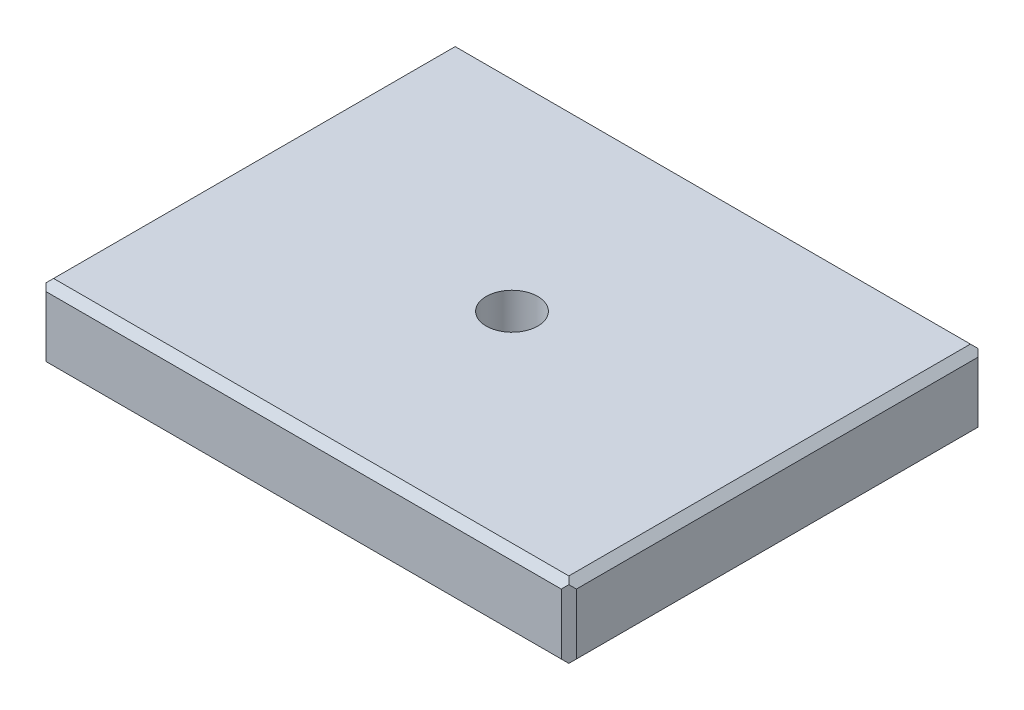
ISO-10303-21;
HEADER;
FILE_DESCRIPTION(('STEP AP214'),'2;1');
FILE_NAME('part.step','',(''),(''),'','','');
FILE_SCHEMA(('AUTOMOTIVE_DESIGN { 1 0 10303 214 1 1 1 1 }'));
ENDSEC;
DATA;
#1=APPLICATION_CONTEXT('core data for automotive mechanical design processes');
#2=APPLICATION_PROTOCOL_DEFINITION('international standard','automotive_design',2000,#1);
#3=PRODUCT_CONTEXT('',#1,'mechanical');
#4=PRODUCT('Part','Part','',(#3));
#5=PRODUCT_RELATED_PRODUCT_CATEGORY('part','',(#4));
#6=PRODUCT_DEFINITION_FORMATION('','',#4);
#7=PRODUCT_DEFINITION_CONTEXT('part definition',#1,'design');
#8=PRODUCT_DEFINITION('design','',#6,#7);
#9=PRODUCT_DEFINITION_SHAPE('','',#8);
#10=(LENGTH_UNIT() NAMED_UNIT(*) SI_UNIT(.MILLI.,.METRE.));
#11=(NAMED_UNIT(*) PLANE_ANGLE_UNIT() SI_UNIT($,.RADIAN.));
#12=(NAMED_UNIT(*) SI_UNIT($,.STERADIAN.) SOLID_ANGLE_UNIT());
#13=UNCERTAINTY_MEASURE_WITH_UNIT(LENGTH_MEASURE(1.E-05),#10,'distance_accuracy_value','');
#14=(GEOMETRIC_REPRESENTATION_CONTEXT(3) GLOBAL_UNCERTAINTY_ASSIGNED_CONTEXT((#13)) GLOBAL_UNIT_ASSIGNED_CONTEXT((#10,
#11,#12)) REPRESENTATION_CONTEXT('',''));
#15=CARTESIAN_POINT('',(0.,0.,0.));
#16=DIRECTION('',(0.,0.,1.));
#17=DIRECTION('',(1.,0.,0.));
#18=AXIS2_PLACEMENT_3D('',#15,#16,#17);
#19=CARTESIAN_POINT('',(35.,-10.,27.5));
#20=DIRECTION('',(1.,0.,0.));
#21=DIRECTION('',(0.,0.,-1.));
#22=AXIS2_PLACEMENT_3D('',#19,#20,#21);
#23=PLANE('',#22);
#24=DIRECTION('',(0.,0.,-1.));
#25=VECTOR('',#24,1.);
#26=CARTESIAN_POINT('',(35.,-9.,27.5));
#27=LINE('',#26,#25);
#28=CARTESIAN_POINT('',(35.,-9.,26.5));
#29=VERTEX_POINT('',#28);
#30=CARTESIAN_POINT('',(35.,-9.,-26.5));
#31=VERTEX_POINT('',#30);
#32=EDGE_CURVE('E230',#29,#31,#27,.T.);
#33=ORIENTED_EDGE('',*,*,#32,.T.);
#34=DIRECTION('',(0.,1.,0.));
#35=VECTOR('',#34,1.);
#36=CARTESIAN_POINT('',(35.,-10.,-26.5));
#37=LINE('',#36,#35);
#38=CARTESIAN_POINT('',(35.,-1.00000000000003,-26.5));
#39=VERTEX_POINT('',#38);
#40=EDGE_CURVE('E310',#31,#39,#37,.T.);
#41=ORIENTED_EDGE('',*,*,#40,.T.);
#42=DIRECTION('',(0.,0.,1.));
#43=VECTOR('',#42,1.);
#44=CARTESIAN_POINT('',(35.,-1.00000000000003,27.5));
#45=LINE('',#44,#43);
#46=CARTESIAN_POINT('',(35.,-1.00000000000003,26.5));
#47=VERTEX_POINT('',#46);
#48=EDGE_CURVE('E226',#39,#47,#45,.T.);
#49=ORIENTED_EDGE('',*,*,#48,.T.);
#50=DIRECTION('',(0.,-1.,0.));
#51=VECTOR('',#50,1.);
#52=CARTESIAN_POINT('',(35.,-10.,26.5));
#53=LINE('',#52,#51);
#54=EDGE_CURVE('E307',#47,#29,#53,.T.);
#55=ORIENTED_EDGE('',*,*,#54,.T.);
#56=EDGE_LOOP('',(#33,#41,#49,#55));
#57=FACE_BOUND('',#56,.T.);
#58=ADVANCED_FACE('F57',(#57),#23,.T.);
#59=CARTESIAN_POINT('',(-35.,-10.,27.5));
#60=DIRECTION('',(0.,0.,1.));
#61=DIRECTION('',(1.,0.,0.));
#62=AXIS2_PLACEMENT_3D('',#59,#60,#61);
#63=PLANE('',#62);
#64=DIRECTION('',(1.,0.,0.));
#65=VECTOR('',#64,1.);
#66=CARTESIAN_POINT('',(-35.,-9.,27.5));
#67=LINE('',#66,#65);
#68=CARTESIAN_POINT('',(-34.,-9.,27.5));
#69=VERTEX_POINT('',#68);
#70=CARTESIAN_POINT('',(34.,-9.,27.5));
#71=VERTEX_POINT('',#70);
#72=EDGE_CURVE('E222',#69,#71,#67,.T.);
#73=ORIENTED_EDGE('',*,*,#72,.T.);
#74=DIRECTION('',(0.,1.,0.));
#75=VECTOR('',#74,1.);
#76=CARTESIAN_POINT('',(34.,-10.,27.5));
#77=LINE('',#76,#75);
#78=CARTESIAN_POINT('',(34.,-1.00000000000003,27.5));
#79=VERTEX_POINT('',#78);
#80=EDGE_CURVE('E329',#71,#79,#77,.T.);
#81=ORIENTED_EDGE('',*,*,#80,.T.);
#82=DIRECTION('',(-1.,0.,0.));
#83=VECTOR('',#82,1.);
#84=CARTESIAN_POINT('',(-35.,-1.00000000000003,27.5));
#85=LINE('',#84,#83);
#86=CARTESIAN_POINT('',(-34.,-1.00000000000003,27.5));
#87=VERTEX_POINT('',#86);
#88=EDGE_CURVE('E219',#79,#87,#85,.T.);
#89=ORIENTED_EDGE('',*,*,#88,.T.);
#90=DIRECTION('',(0.,-1.,0.));
#91=VECTOR('',#90,1.);
#92=CARTESIAN_POINT('',(-34.,-10.,27.5));
#93=LINE('',#92,#91);
#94=EDGE_CURVE('E326',#87,#69,#93,.T.);
#95=ORIENTED_EDGE('',*,*,#94,.T.);
#96=EDGE_LOOP('',(#73,#81,#89,#95));
#97=FACE_BOUND('',#96,.T.);
#98=ADVANCED_FACE('F388',(#97),#63,.T.);
#99=CARTESIAN_POINT('',(-35.,-10.,27.5));
#100=DIRECTION('',(-1.,0.,0.));
#101=DIRECTION('',(0.,0.,1.));
#102=AXIS2_PLACEMENT_3D('',#99,#100,#101);
#103=PLANE('',#102);
#104=DIRECTION('',(0.,0.,-1.));
#105=VECTOR('',#104,1.);
#106=CARTESIAN_POINT('',(-35.,-1.00000000000003,-27.5));
#107=LINE('',#106,#105);
#108=CARTESIAN_POINT('',(-35.,-1.00000000000003,26.5));
#109=VERTEX_POINT('',#108);
#110=CARTESIAN_POINT('',(-35.,-1.00000000000003,-26.5));
#111=VERTEX_POINT('',#110);
#112=EDGE_CURVE('E205',#109,#111,#107,.T.);
#113=ORIENTED_EDGE('',*,*,#112,.T.);
#114=DIRECTION('',(0.,-1.,0.));
#115=VECTOR('',#114,1.);
#116=CARTESIAN_POINT('',(-35.,-10.,-26.5));
#117=LINE('',#116,#115);
#118=CARTESIAN_POINT('',(-35.,-9.,-26.5));
#119=VERTEX_POINT('',#118);
#120=EDGE_CURVE('E293',#111,#119,#117,.T.);
#121=ORIENTED_EDGE('',*,*,#120,.T.);
#122=DIRECTION('',(0.,0.,1.));
#123=VECTOR('',#122,1.);
#124=CARTESIAN_POINT('',(-35.,-9.,27.5));
#125=LINE('',#124,#123);
#126=CARTESIAN_POINT('',(-35.,-9.,26.5));
#127=VERTEX_POINT('',#126);
#128=EDGE_CURVE('E211',#119,#127,#125,.T.);
#129=ORIENTED_EDGE('',*,*,#128,.T.);
#130=DIRECTION('',(0.,1.,0.));
#131=VECTOR('',#130,1.);
#132=CARTESIAN_POINT('',(-35.,-10.,26.5));
#133=LINE('',#132,#131);
#134=EDGE_CURVE('E289',#127,#109,#133,.T.);
#135=ORIENTED_EDGE('',*,*,#134,.T.);
#136=EDGE_LOOP('',(#113,#121,#129,#135));
#137=FACE_BOUND('',#136,.T.);
#138=ADVANCED_FACE('F351',(#137),#103,.T.);
#139=CARTESIAN_POINT('',(-35.,-10.,-27.5));
#140=DIRECTION('',(0.,0.,-1.));
#141=DIRECTION('',(-1.,0.,0.));
#142=AXIS2_PLACEMENT_3D('',#139,#140,#141);
#143=PLANE('',#142);
#144=DIRECTION('',(-1.,0.,0.));
#145=VECTOR('',#144,1.);
#146=CARTESIAN_POINT('',(-35.,-9.,-27.5));
#147=LINE('',#146,#145);
#148=CARTESIAN_POINT('',(34.,-9.,-27.5));
#149=VERTEX_POINT('',#148);
#150=CARTESIAN_POINT('',(-34.,-9.,-27.5));
#151=VERTEX_POINT('',#150);
#152=EDGE_CURVE('E199',#149,#151,#147,.T.);
#153=ORIENTED_EDGE('',*,*,#152,.T.);
#154=DIRECTION('',(0.,1.,0.));
#155=VECTOR('',#154,1.);
#156=CARTESIAN_POINT('',(-34.,-10.,-27.5));
#157=LINE('',#156,#155);
#158=CARTESIAN_POINT('',(-34.,-1.00000000000003,-27.5));
#159=VERTEX_POINT('',#158);
#160=EDGE_CURVE('E273',#151,#159,#157,.T.);
#161=ORIENTED_EDGE('',*,*,#160,.T.);
#162=DIRECTION('',(1.,0.,0.));
#163=VECTOR('',#162,1.);
#164=CARTESIAN_POINT('',(35.,-1.00000000000003,-27.5));
#165=LINE('',#164,#163);
#166=CARTESIAN_POINT('',(34.,-1.00000000000003,-27.5));
#167=VERTEX_POINT('',#166);
#168=EDGE_CURVE('E257',#159,#167,#165,.T.);
#169=ORIENTED_EDGE('',*,*,#168,.T.);
#170=DIRECTION('',(0.,-1.,0.));
#171=VECTOR('',#170,1.);
#172=CARTESIAN_POINT('',(34.,-10.,-27.5));
#173=LINE('',#172,#171);
#174=EDGE_CURVE('E248',#167,#149,#173,.T.);
#175=ORIENTED_EDGE('',*,*,#174,.T.);
#176=EDGE_LOOP('',(#153,#161,#169,#175));
#177=FACE_BOUND('',#176,.T.);
#178=ADVANCED_FACE('F368',(#177),#143,.T.);
#179=CARTESIAN_POINT('',(0.,-10.,0.));
#180=DIRECTION('',(0.,-1.,0.));
#181=DIRECTION('',(0.,0.,-1.));
#182=AXIS2_PLACEMENT_3D('',#179,#180,#181);
#183=PLANE('',#182);
#184=CARTESIAN_POINT('',(0.,-10.,0.));
#185=DIRECTION('',(0.,1.,0.));
#186=DIRECTION('',(0.,0.,1.));
#187=AXIS2_PLACEMENT_3D('',#184,#185,#186);
#188=CIRCLE('',#187,3.4);
#189=CARTESIAN_POINT('',(0.,-10.,3.4));
#190=VERTEX_POINT('',#189);
#191=EDGE_CURVE('E262',#190,#190,#188,.T.);
#192=ORIENTED_EDGE('',*,*,#191,.T.);
#193=EDGE_LOOP('',(#192));
#194=FACE_BOUND('',#193,.T.);
#195=DIRECTION('',(0.,0.,-1.));
#196=VECTOR('',#195,1.);
#197=CARTESIAN_POINT('',(-34.,-10.,0.));
#198=LINE('',#197,#196);
#199=CARTESIAN_POINT('',(-34.,-10.,26.5));
#200=VERTEX_POINT('',#199);
#201=CARTESIAN_POINT('',(-34.,-10.,-26.5));
#202=VERTEX_POINT('',#201);
#203=EDGE_CURVE('E203',#200,#202,#198,.T.);
#204=ORIENTED_EDGE('',*,*,#203,.T.);
#205=DIRECTION('',(1.,0.,0.));
#206=VECTOR('',#205,1.);
#207=CARTESIAN_POINT('',(0.,-10.,-26.5));
#208=LINE('',#207,#206);
#209=CARTESIAN_POINT('',(34.,-10.,-26.5));
#210=VERTEX_POINT('',#209);
#211=EDGE_CURVE('E179',#202,#210,#208,.T.);
#212=ORIENTED_EDGE('',*,*,#211,.T.);
#213=DIRECTION('',(0.,0.,1.));
#214=VECTOR('',#213,1.);
#215=CARTESIAN_POINT('',(34.,-10.,0.));
#216=LINE('',#215,#214);
#217=CARTESIAN_POINT('',(34.,-10.,26.5));
#218=VERTEX_POINT('',#217);
#219=EDGE_CURVE('E191',#210,#218,#216,.T.);
#220=ORIENTED_EDGE('',*,*,#219,.T.);
#221=DIRECTION('',(-1.,0.,0.));
#222=VECTOR('',#221,1.);
#223=CARTESIAN_POINT('',(0.,-10.,26.5));
#224=LINE('',#223,#222);
#225=EDGE_CURVE('E198',#218,#200,#224,.T.);
#226=ORIENTED_EDGE('',*,*,#225,.T.);
#227=EDGE_LOOP('',(#204,#212,#220,#226));
#228=FACE_BOUND('',#227,.T.);
#229=ADVANCED_FACE('F201',(#194,#228),#183,.T.);
#230=CARTESIAN_POINT('',(0.,0.,0.));
#231=DIRECTION('',(0.,-1.,0.));
#232=DIRECTION('',(0.,0.,-1.));
#233=AXIS2_PLACEMENT_3D('',#230,#231,#232);
#234=PLANE('',#233);
#235=CARTESIAN_POINT('',(0.,0.,0.));
#236=DIRECTION('',(0.,1.,0.));
#237=DIRECTION('',(0.,0.,1.));
#238=AXIS2_PLACEMENT_3D('',#235,#236,#237);
#239=CIRCLE('',#238,3.4);
#240=CARTESIAN_POINT('',(0.,0.,3.4));
#241=VERTEX_POINT('',#240);
#242=EDGE_CURVE('E608',#241,#241,#239,.T.);
#243=ORIENTED_EDGE('',*,*,#242,.F.);
#244=EDGE_LOOP('',(#243));
#245=FACE_BOUND('',#244,.T.);
#246=DIRECTION('',(0.,0.,1.));
#247=VECTOR('',#246,1.);
#248=CARTESIAN_POINT('',(-34.,0.,27.5));
#249=LINE('',#248,#247);
#250=CARTESIAN_POINT('',(-34.,0.,-26.5));
#251=VERTEX_POINT('',#250);
#252=CARTESIAN_POINT('',(-34.,0.,26.5));
#253=VERTEX_POINT('',#252);
#254=EDGE_CURVE('E241',#251,#253,#249,.T.);
#255=ORIENTED_EDGE('',*,*,#254,.T.);
#256=DIRECTION('',(1.,0.,0.));
#257=VECTOR('',#256,1.);
#258=CARTESIAN_POINT('',(35.,0.,26.5));
#259=LINE('',#258,#257);
#260=CARTESIAN_POINT('',(34.,0.,26.5));
#261=VERTEX_POINT('',#260);
#262=EDGE_CURVE('E244',#253,#261,#259,.T.);
#263=ORIENTED_EDGE('',*,*,#262,.T.);
#264=DIRECTION('',(0.,0.,-1.));
#265=VECTOR('',#264,1.);
#266=CARTESIAN_POINT('',(34.,0.,-27.5));
#267=LINE('',#266,#265);
#268=CARTESIAN_POINT('',(34.,0.,-26.5));
#269=VERTEX_POINT('',#268);
#270=EDGE_CURVE('E234',#261,#269,#267,.T.);
#271=ORIENTED_EDGE('',*,*,#270,.T.);
#272=DIRECTION('',(-1.,0.,0.));
#273=VECTOR('',#272,1.);
#274=CARTESIAN_POINT('',(-35.,0.,-26.5));
#275=LINE('',#274,#273);
#276=EDGE_CURVE('E238',#269,#251,#275,.T.);
#277=ORIENTED_EDGE('',*,*,#276,.T.);
#278=EDGE_LOOP('',(#255,#263,#271,#277));
#279=FACE_BOUND('',#278,.T.);
#280=ADVANCED_FACE('F403',(#245,#279),#234,.F.);
#281=CARTESIAN_POINT('',(-35.,-9.,27.5));
#282=DIRECTION('',(0.,0.707106781186547,-0.707106781186547));
#283=DIRECTION('',(1.,0.,0.));
#284=AXIS2_PLACEMENT_3D('',#281,#282,#283);
#285=PLANE('',#284);
#286=DIRECTION('',(-0.577350269189626,-0.577350269189626,-0.577350269189626));
#287=VECTOR('',#286,1.);
#288=CARTESIAN_POINT('',(35.,-9.,27.5));
#289=LINE('',#288,#287);
#290=CARTESIAN_POINT('',(34.5,-9.50000000000001,27.));
#291=VERTEX_POINT('',#290);
#292=EDGE_CURVE('E194',#291,#218,#289,.T.);
#293=ORIENTED_EDGE('',*,*,#292,.F.);
#294=DIRECTION('',(-0.57735026918962,0.577350269189628,0.577350269189628));
#295=VECTOR('',#294,1.);
#296=CARTESIAN_POINT('',(11.0000000000004,13.9999999999999,50.4999999999999));
#297=LINE('',#296,#295);
#298=EDGE_CURVE('E11',#291,#71,#297,.T.);
#299=ORIENTED_EDGE('',*,*,#298,.T.);
#300=ORIENTED_EDGE('',*,*,#72,.F.);
#301=DIRECTION('',(-0.577350269189626,-0.577350269189626,-0.577350269189626));
#302=VECTOR('',#301,1.);
#303=CARTESIAN_POINT('',(-34.3333333333333,-9.33333333333333,27.1666666666667));
#304=LINE('',#303,#302);
#305=CARTESIAN_POINT('',(-34.5,-9.5,27.));
#306=VERTEX_POINT('',#305);
#307=EDGE_CURVE('E67',#69,#306,#304,.T.);
#308=ORIENTED_EDGE('',*,*,#307,.T.);
#309=DIRECTION('',(0.577350269189626,-0.577350269189626,-0.577350269189626));
#310=VECTOR('',#309,1.);
#311=CARTESIAN_POINT('',(-35.,-9.,27.5));
#312=LINE('',#311,#310);
#313=EDGE_CURVE('E187',#200,#306,#312,.F.);
#314=ORIENTED_EDGE('',*,*,#313,.F.);
#315=ORIENTED_EDGE('',*,*,#225,.F.);
#316=EDGE_LOOP('',(#293,#299,#300,#308,#314,#315));
#317=FACE_BOUND('',#316,.T.);
#318=ADVANCED_FACE('F341',(#317),#285,.F.);
#319=CARTESIAN_POINT('',(35.,-9.,27.5));
#320=DIRECTION('',(-0.707106781186547,0.707106781186547,0.));
#321=DIRECTION('',(0.,0.,-1.));
#322=AXIS2_PLACEMENT_3D('',#319,#320,#321);
#323=PLANE('',#322);
#324=DIRECTION('',(0.577350269189626,0.577350269189626,-0.577350269189626));
#325=VECTOR('',#324,1.);
#326=CARTESIAN_POINT('',(16.6666666666667,-27.3333333333333,-9.16666666666667));
#327=LINE('',#326,#325);
#328=CARTESIAN_POINT('',(34.5,-9.50000000000001,-27.));
#329=VERTEX_POINT('',#328);
#330=EDGE_CURVE('E174',#329,#210,#327,.F.);
#331=ORIENTED_EDGE('',*,*,#330,.F.);
#332=DIRECTION('',(0.577350269189626,0.577350269189626,0.577350269189624));
#333=VECTOR('',#332,1.);
#334=CARTESIAN_POINT('',(53.,8.99999999999998,-8.50000000000008));
#335=LINE('',#334,#333);
#336=EDGE_CURVE('E323',#329,#31,#335,.T.);
#337=ORIENTED_EDGE('',*,*,#336,.T.);
#338=ORIENTED_EDGE('',*,*,#32,.F.);
#339=DIRECTION('',(-0.577350269189623,-0.577350269189623,0.577350269189631));
#340=VECTOR('',#339,1.);
#341=CARTESIAN_POINT('',(34.6666666666667,-9.33333333333334,26.8333333333333));
#342=LINE('',#341,#340);
#343=EDGE_CURVE('E320',#29,#291,#342,.T.);
#344=ORIENTED_EDGE('',*,*,#343,.T.);
#345=ORIENTED_EDGE('',*,*,#292,.T.);
#346=ORIENTED_EDGE('',*,*,#219,.F.);
#347=EDGE_LOOP('',(#331,#337,#338,#344,#345,#346));
#348=FACE_BOUND('',#347,.T.);
#349=ADVANCED_FACE('F192',(#348),#323,.F.);
#350=CARTESIAN_POINT('',(-35.,-9.,27.5));
#351=DIRECTION('',(0.707106781186547,0.707106781186547,0.));
#352=DIRECTION('',(0.,0.,1.));
#353=AXIS2_PLACEMENT_3D('',#350,#351,#352);
#354=PLANE('',#353);
#355=ORIENTED_EDGE('',*,*,#128,.F.);
#356=DIRECTION('',(0.577350269189624,-0.577350269189624,-0.57735026918963));
#357=VECTOR('',#356,1.);
#358=CARTESIAN_POINT('',(-53.,9.00000000000006,-8.49999999999974));
#359=LINE('',#358,#357);
#360=CARTESIAN_POINT('',(-34.5,-9.50000000000002,-27.));
#361=VERTEX_POINT('',#360);
#362=EDGE_CURVE('E299',#119,#361,#359,.T.);
#363=ORIENTED_EDGE('',*,*,#362,.T.);
#364=DIRECTION('',(0.577350269189626,-0.577350269189626,0.577350269189626));
#365=VECTOR('',#364,1.);
#366=CARTESIAN_POINT('',(-16.6666666666666,-27.3333333333333,-9.16666666666667));
#367=LINE('',#366,#365);
#368=EDGE_CURVE('E188',#202,#361,#367,.F.);
#369=ORIENTED_EDGE('',*,*,#368,.F.);
#370=ORIENTED_EDGE('',*,*,#203,.F.);
#371=ORIENTED_EDGE('',*,*,#313,.T.);
#372=DIRECTION('',(-0.577350269189626,0.577350269189626,-0.577350269189626));
#373=VECTOR('',#372,1.);
#374=CARTESIAN_POINT('',(-34.6666666666667,-9.33333333333333,26.8333333333333));
#375=LINE('',#374,#373);
#376=EDGE_CURVE('E296',#306,#127,#375,.T.);
#377=ORIENTED_EDGE('',*,*,#376,.T.);
#378=EDGE_LOOP('',(#355,#363,#369,#370,#371,#377));
#379=FACE_BOUND('',#378,.T.);
#380=ADVANCED_FACE('F347',(#379),#354,.F.);
#381=CARTESIAN_POINT('',(-35.,-9.,-27.5));
#382=DIRECTION('',(0.,0.707106781186547,0.707106781186547));
#383=DIRECTION('',(-1.,0.,0.));
#384=AXIS2_PLACEMENT_3D('',#381,#382,#383);
#385=PLANE('',#384);
#386=ORIENTED_EDGE('',*,*,#368,.T.);
#387=DIRECTION('',(0.577350269189622,0.577350269189628,-0.577350269189628));
#388=VECTOR('',#387,1.);
#389=CARTESIAN_POINT('',(-34.3333333333333,-9.33333333333334,-27.1666666666667));
#390=LINE('',#389,#388);
#391=EDGE_CURVE('E304',#361,#151,#390,.T.);
#392=ORIENTED_EDGE('',*,*,#391,.T.);
#393=ORIENTED_EDGE('',*,*,#152,.F.);
#394=DIRECTION('',(0.577350269189627,-0.577350269189625,0.577350269189625));
#395=VECTOR('',#394,1.);
#396=CARTESIAN_POINT('',(10.9999999999999,14.,-50.5));
#397=LINE('',#396,#395);
#398=EDGE_CURVE('E183',#149,#329,#397,.T.);
#399=ORIENTED_EDGE('',*,*,#398,.T.);
#400=ORIENTED_EDGE('',*,*,#330,.T.);
#401=ORIENTED_EDGE('',*,*,#211,.F.);
#402=EDGE_LOOP('',(#386,#392,#393,#399,#400,#401));
#403=FACE_BOUND('',#402,.T.);
#404=ADVANCED_FACE('F177',(#403),#385,.F.);
#405=CARTESIAN_POINT('',(0.,0.,-26.5));
#406=DIRECTION('',(0.,0.707106781186543,-0.707106781186552));
#407=DIRECTION('',(1.,0.,0.));
#408=AXIS2_PLACEMENT_3D('',#405,#406,#407);
#409=PLANE('',#408);
#410=ORIENTED_EDGE('',*,*,#168,.F.);
#411=DIRECTION('',(0.577350269189619,-0.577350269189633,-0.577350269189625));
#412=VECTOR('',#411,1.);
#413=CARTESIAN_POINT('',(-23.3333333333336,-11.6666666666667,-38.1666666666665));
#414=LINE('',#413,#412);
#415=CARTESIAN_POINT('',(-34.5,-0.500000000000007,-27.));
#416=VERTEX_POINT('',#415);
#417=EDGE_CURVE('E280',#159,#416,#414,.F.);
#418=ORIENTED_EDGE('',*,*,#417,.T.);
#419=DIRECTION('',(0.577350269189623,0.577350269189631,0.577350269189623));
#420=VECTOR('',#419,1.);
#421=CARTESIAN_POINT('',(-22.6666666666668,11.3333333333334,-15.1666666666668));
#422=LINE('',#421,#420);
#423=EDGE_CURVE('E250',#251,#416,#422,.F.);
#424=ORIENTED_EDGE('',*,*,#423,.F.);
#425=ORIENTED_EDGE('',*,*,#276,.F.);
#426=DIRECTION('',(-0.577350269189623,0.577350269189631,0.577350269189623));
#427=VECTOR('',#426,1.);
#428=CARTESIAN_POINT('',(25.1666666666668,8.83333333333337,-17.6666666666667));
#429=LINE('',#428,#427);
#430=CARTESIAN_POINT('',(34.5,-0.500000000000013,-27.));
#431=VERTEX_POINT('',#430);
#432=EDGE_CURVE('E265',#431,#269,#429,.T.);
#433=ORIENTED_EDGE('',*,*,#432,.F.);
#434=DIRECTION('',(0.577350269189625,0.577350269189631,0.577350269189623));
#435=VECTOR('',#434,1.);
#436=CARTESIAN_POINT('',(23.3333333333334,-11.6666666666667,-38.1666666666666));
#437=LINE('',#436,#435);
#438=EDGE_CURVE('E277',#431,#167,#437,.F.);
#439=ORIENTED_EDGE('',*,*,#438,.T.);
#440=EDGE_LOOP('',(#410,#418,#424,#425,#433,#439));
#441=FACE_BOUND('',#440,.T.);
#442=ADVANCED_FACE('F371',(#441),#409,.T.);
#443=CARTESIAN_POINT('',(-34.,0.,0.));
#444=DIRECTION('',(-0.707106781186552,0.707106781186543,0.));
#445=DIRECTION('',(0.,0.,-1.));
#446=AXIS2_PLACEMENT_3D('',#443,#444,#445);
#447=PLANE('',#446);
#448=ORIENTED_EDGE('',*,*,#423,.T.);
#449=DIRECTION('',(0.577350269189621,0.577350269189629,-0.577350269189627));
#450=VECTOR('',#449,1.);
#451=CARTESIAN_POINT('',(-43.1666666666666,-9.16666666666674,-18.3333333333333));
#452=LINE('',#451,#450);
#453=EDGE_CURVE('E286',#416,#111,#452,.F.);
#454=ORIENTED_EDGE('',*,*,#453,.T.);
#455=ORIENTED_EDGE('',*,*,#112,.F.);
#456=DIRECTION('',(-0.577350269189623,-0.577350269189631,-0.577350269189623));
#457=VECTOR('',#456,1.);
#458=CARTESIAN_POINT('',(-43.1666666666666,-9.16666666666671,18.3333333333334));
#459=LINE('',#458,#457);
#460=CARTESIAN_POINT('',(-34.5,-0.50000000000002,27.));
#461=VERTEX_POINT('',#460);
#462=EDGE_CURVE('E283',#109,#461,#459,.F.);
#463=ORIENTED_EDGE('',*,*,#462,.T.);
#464=DIRECTION('',(0.577350269189623,0.577350269189631,-0.577350269189623));
#465=VECTOR('',#464,1.);
#466=CARTESIAN_POINT('',(-25.1666666666667,8.83333333333337,17.6666666666667));
#467=LINE('',#466,#465);
#468=EDGE_CURVE('E261',#253,#461,#467,.F.);
#469=ORIENTED_EDGE('',*,*,#468,.F.);
#470=ORIENTED_EDGE('',*,*,#254,.F.);
#471=EDGE_LOOP('',(#448,#454,#455,#463,#469,#470));
#472=FACE_BOUND('',#471,.T.);
#473=ADVANCED_FACE('F354',(#472),#447,.T.);
#474=CARTESIAN_POINT('',(34.,0.,0.));
#475=DIRECTION('',(0.707106781186552,0.707106781186543,0.));
#476=DIRECTION('',(0.,0.,1.));
#477=AXIS2_PLACEMENT_3D('',#474,#475,#476);
#478=PLANE('',#477);
#479=ORIENTED_EDGE('',*,*,#48,.F.);
#480=DIRECTION('',(0.577350269189624,-0.577350269189632,0.577350269189622));
#481=VECTOR('',#480,1.);
#482=CARTESIAN_POINT('',(43.1666666666666,-9.1666666666667,-18.3333333333335));
#483=LINE('',#482,#481);
#484=EDGE_CURVE('E317',#39,#431,#483,.F.);
#485=ORIENTED_EDGE('',*,*,#484,.T.);
#486=ORIENTED_EDGE('',*,*,#432,.T.);
#487=ORIENTED_EDGE('',*,*,#270,.F.);
#488=DIRECTION('',(0.577350269189623,-0.577350269189631,0.577350269189623));
#489=VECTOR('',#488,1.);
#490=CARTESIAN_POINT('',(25.1666666666668,8.83333333333337,17.6666666666667));
#491=LINE('',#490,#489);
#492=CARTESIAN_POINT('',(34.5,-0.500000000000009,27.));
#493=VERTEX_POINT('',#492);
#494=EDGE_CURVE('E258',#493,#261,#491,.F.);
#495=ORIENTED_EDGE('',*,*,#494,.F.);
#496=DIRECTION('',(-0.57735026918962,0.577350269189628,0.577350269189628));
#497=VECTOR('',#496,1.);
#498=CARTESIAN_POINT('',(43.1666666666666,-9.16666666666675,18.3333333333333));
#499=LINE('',#498,#497);
#500=EDGE_CURVE('E314',#493,#47,#499,.F.);
#501=ORIENTED_EDGE('',*,*,#500,.T.);
#502=EDGE_LOOP('',(#479,#485,#486,#487,#495,#501));
#503=FACE_BOUND('',#502,.T.);
#504=ADVANCED_FACE('F395',(#503),#478,.T.);
#505=CARTESIAN_POINT('',(0.,0.,26.5));
#506=DIRECTION('',(0.,0.707106781186543,0.707106781186552));
#507=DIRECTION('',(-1.,0.,0.));
#508=AXIS2_PLACEMENT_3D('',#505,#506,#507);
#509=PLANE('',#508);
#510=ORIENTED_EDGE('',*,*,#88,.F.);
#511=DIRECTION('',(-0.577350269189618,-0.577350269189634,0.577350269189626));
#512=VECTOR('',#511,1.);
#513=CARTESIAN_POINT('',(23.3333333333337,-11.6666666666667,38.1666666666665));
#514=LINE('',#513,#512);
#515=EDGE_CURVE('E82',#79,#493,#514,.F.);
#516=ORIENTED_EDGE('',*,*,#515,.T.);
#517=ORIENTED_EDGE('',*,*,#494,.T.);
#518=ORIENTED_EDGE('',*,*,#262,.F.);
#519=ORIENTED_EDGE('',*,*,#468,.T.);
#520=DIRECTION('',(-0.577350269189623,0.577350269189631,-0.577350269189623));
#521=VECTOR('',#520,1.);
#522=CARTESIAN_POINT('',(-23.3333333333334,-11.6666666666667,38.1666666666665));
#523=LINE('',#522,#521);
#524=EDGE_CURVE('E74',#461,#87,#523,.F.);
#525=ORIENTED_EDGE('',*,*,#524,.T.);
#526=EDGE_LOOP('',(#510,#516,#517,#518,#519,#525));
#527=FACE_BOUND('',#526,.T.);
#528=ADVANCED_FACE('F389',(#527),#509,.T.);
#529=CARTESIAN_POINT('',(0.,0.,0.));
#530=DIRECTION('',(0.,1.,0.));
#531=DIRECTION('',(0.,0.,1.));
#532=AXIS2_PLACEMENT_3D('',#529,#530,#531);
#533=CYLINDRICAL_SURFACE('',#532,3.4);
#534=ORIENTED_EDGE('',*,*,#191,.F.);
#535=EDGE_LOOP('',(#534));
#536=FACE_BOUND('',#535,.T.);
#537=ORIENTED_EDGE('',*,*,#242,.T.);
#538=EDGE_LOOP('',(#537));
#539=FACE_BOUND('',#538,.T.);
#540=ADVANCED_FACE('F453',(#536,#539),#533,.F.);
#541=CARTESIAN_POINT('',(-34.,-10.,-27.5));
#542=DIRECTION('',(0.707106781186551,0.,0.707106781186544));
#543=DIRECTION('',(0.,1.,0.));
#544=AXIS2_PLACEMENT_3D('',#541,#542,#543);
#545=PLANE('',#544);
#546=ORIENTED_EDGE('',*,*,#362,.F.);
#547=ORIENTED_EDGE('',*,*,#120,.F.);
#548=ORIENTED_EDGE('',*,*,#453,.F.);
#549=ORIENTED_EDGE('',*,*,#417,.F.);
#550=ORIENTED_EDGE('',*,*,#160,.F.);
#551=ORIENTED_EDGE('',*,*,#391,.F.);
#552=EDGE_LOOP('',(#546,#547,#548,#549,#550,#551));
#553=FACE_BOUND('',#552,.T.);
#554=ADVANCED_FACE('F361',(#553),#545,.F.);
#555=CARTESIAN_POINT('',(35.,-10.,-26.5));
#556=DIRECTION('',(-0.707106781186546,0.,0.707106781186549));
#557=DIRECTION('',(0.,1.,0.));
#558=AXIS2_PLACEMENT_3D('',#555,#556,#557);
#559=PLANE('',#558);
#560=ORIENTED_EDGE('',*,*,#398,.F.);
#561=ORIENTED_EDGE('',*,*,#174,.F.);
#562=ORIENTED_EDGE('',*,*,#438,.F.);
#563=ORIENTED_EDGE('',*,*,#484,.F.);
#564=ORIENTED_EDGE('',*,*,#40,.F.);
#565=ORIENTED_EDGE('',*,*,#336,.F.);
#566=EDGE_LOOP('',(#560,#561,#562,#563,#564,#565));
#567=FACE_BOUND('',#566,.T.);
#568=ADVANCED_FACE('F400',(#567),#559,.F.);
#569=CARTESIAN_POINT('',(34.,-10.,27.5));
#570=DIRECTION('',(-0.707106781186552,0.,-0.707106781186543));
#571=DIRECTION('',(0.,1.,0.));
#572=AXIS2_PLACEMENT_3D('',#569,#570,#571);
#573=PLANE('',#572);
#574=ORIENTED_EDGE('',*,*,#343,.F.);
#575=ORIENTED_EDGE('',*,*,#54,.F.);
#576=ORIENTED_EDGE('',*,*,#500,.F.);
#577=ORIENTED_EDGE('',*,*,#515,.F.);
#578=ORIENTED_EDGE('',*,*,#80,.F.);
#579=ORIENTED_EDGE('',*,*,#298,.F.);
#580=EDGE_LOOP('',(#574,#575,#576,#577,#578,#579));
#581=FACE_BOUND('',#580,.T.);
#582=ADVANCED_FACE('F385',(#581),#573,.F.);
#583=CARTESIAN_POINT('',(-35.,-10.,26.5));
#584=DIRECTION('',(0.707106781186547,0.,-0.707106781186547));
#585=DIRECTION('',(0.,1.,0.));
#586=AXIS2_PLACEMENT_3D('',#583,#584,#585);
#587=PLANE('',#586);
#588=ORIENTED_EDGE('',*,*,#307,.F.);
#589=ORIENTED_EDGE('',*,*,#94,.F.);
#590=ORIENTED_EDGE('',*,*,#524,.F.);
#591=ORIENTED_EDGE('',*,*,#462,.F.);
#592=ORIENTED_EDGE('',*,*,#134,.F.);
#593=ORIENTED_EDGE('',*,*,#376,.F.);
#594=EDGE_LOOP('',(#588,#589,#590,#591,#592,#593));
#595=FACE_BOUND('',#594,.T.);
#596=ADVANCED_FACE('F60',(#595),#587,.F.);
#597=CLOSED_SHELL('',(#58,#98,#138,#178,#229,#280,#318,#349,#380,#404,#442,#473,#504,#528,#540,
#554,#568,#582,#596));
#598=MANIFOLD_SOLID_BREP('B2',#597);
#599=ADVANCED_BREP_SHAPE_REPRESENTATION('',(#18,#598),#14);
#600=SHAPE_DEFINITION_REPRESENTATION(#9,#599);
ENDSEC;
END-ISO-10303-21;
